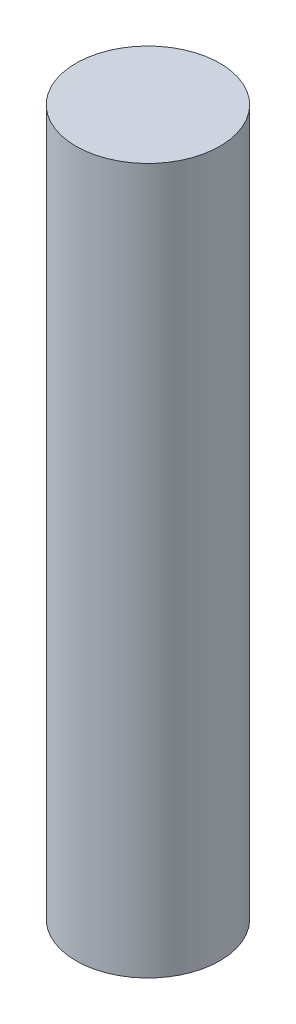
ISO-10303-21;
HEADER;
FILE_DESCRIPTION(('STEP AP214'),'2;1');
FILE_NAME('part.step','',(''),(''),'','','');
FILE_SCHEMA(('AUTOMOTIVE_DESIGN { 1 0 10303 214 1 1 1 1 }'));
ENDSEC;
DATA;
#1=APPLICATION_CONTEXT('core data for automotive mechanical design processes');
#2=APPLICATION_PROTOCOL_DEFINITION('international standard','automotive_design',2000,#1);
#3=PRODUCT_CONTEXT('',#1,'mechanical');
#4=PRODUCT('Part','Part','',(#3));
#5=PRODUCT_RELATED_PRODUCT_CATEGORY('part','',(#4));
#6=PRODUCT_DEFINITION_FORMATION('','',#4);
#7=PRODUCT_DEFINITION_CONTEXT('part definition',#1,'design');
#8=PRODUCT_DEFINITION('design','',#6,#7);
#9=PRODUCT_DEFINITION_SHAPE('','',#8);
#10=(LENGTH_UNIT() NAMED_UNIT(*) SI_UNIT(.MILLI.,.METRE.));
#11=(NAMED_UNIT(*) PLANE_ANGLE_UNIT() SI_UNIT($,.RADIAN.));
#12=(NAMED_UNIT(*) SI_UNIT($,.STERADIAN.) SOLID_ANGLE_UNIT());
#13=UNCERTAINTY_MEASURE_WITH_UNIT(LENGTH_MEASURE(1.E-05),#10,'distance_accuracy_value','');
#14=(GEOMETRIC_REPRESENTATION_CONTEXT(3) GLOBAL_UNCERTAINTY_ASSIGNED_CONTEXT((#13)) GLOBAL_UNIT_ASSIGNED_CONTEXT((#10,
#11,#12)) REPRESENTATION_CONTEXT('',''));
#15=CARTESIAN_POINT('',(0.,0.,0.));
#16=DIRECTION('',(0.,0.,1.));
#17=DIRECTION('',(1.,0.,0.));
#18=AXIS2_PLACEMENT_3D('',#15,#16,#17);
#19=CARTESIAN_POINT('',(0.,25.,0.));
#20=DIRECTION('',(0.,-1.,0.));
#21=DIRECTION('',(0.,0.,-1.));
#22=AXIS2_PLACEMENT_3D('',#19,#20,#21);
#23=CYLINDRICAL_SURFACE('',#22,2.55);
#24=CARTESIAN_POINT('',(0.,25.,0.));
#25=DIRECTION('',(0.,1.,0.));
#26=DIRECTION('',(0.,0.,1.));
#27=AXIS2_PLACEMENT_3D('',#24,#25,#26);
#28=CIRCLE('',#27,2.55);
#29=CARTESIAN_POINT('',(0.,25.,2.55));
#30=VERTEX_POINT('',#29);
#31=EDGE_CURVE('E10',#30,#30,#28,.T.);
#32=ORIENTED_EDGE('',*,*,#31,.F.);
#33=EDGE_LOOP('',(#32));
#34=FACE_BOUND('',#33,.T.);
#35=CARTESIAN_POINT('',(0.,0.,0.));
#36=DIRECTION('',(0.,1.,0.));
#37=DIRECTION('',(0.,0.,1.));
#38=AXIS2_PLACEMENT_3D('',#35,#36,#37);
#39=CIRCLE('',#38,2.55);
#40=CARTESIAN_POINT('',(0.,0.,2.55));
#41=VERTEX_POINT('',#40);
#42=EDGE_CURVE('E36',#41,#41,#39,.T.);
#43=ORIENTED_EDGE('',*,*,#42,.T.);
#44=EDGE_LOOP('',(#43));
#45=FACE_BOUND('',#44,.T.);
#46=ADVANCED_FACE('F33',(#34,#45),#23,.T.);
#47=CARTESIAN_POINT('',(0.,25.,0.));
#48=DIRECTION('',(0.,1.,0.));
#49=DIRECTION('',(0.,0.,1.));
#50=AXIS2_PLACEMENT_3D('',#47,#48,#49);
#51=PLANE('',#50);
#52=ORIENTED_EDGE('',*,*,#31,.T.);
#53=EDGE_LOOP('',(#52));
#54=FACE_BOUND('',#53,.T.);
#55=ADVANCED_FACE('F48',(#54),#51,.T.);
#56=CARTESIAN_POINT('',(0.,0.,0.));
#57=DIRECTION('',(0.,1.,0.));
#58=DIRECTION('',(0.,0.,1.));
#59=AXIS2_PLACEMENT_3D('',#56,#57,#58);
#60=PLANE('',#59);
#61=ORIENTED_EDGE('',*,*,#42,.F.);
#62=EDGE_LOOP('',(#61));
#63=FACE_BOUND('',#62,.T.);
#64=ADVANCED_FACE('F46',(#63),#60,.F.);
#65=CLOSED_SHELL('',(#46,#55,#64));
#66=MANIFOLD_SOLID_BREP('B2',#65);
#67=ADVANCED_BREP_SHAPE_REPRESENTATION('',(#18,#66),#14);
#68=SHAPE_DEFINITION_REPRESENTATION(#9,#67);
ENDSEC;
END-ISO-10303-21;
